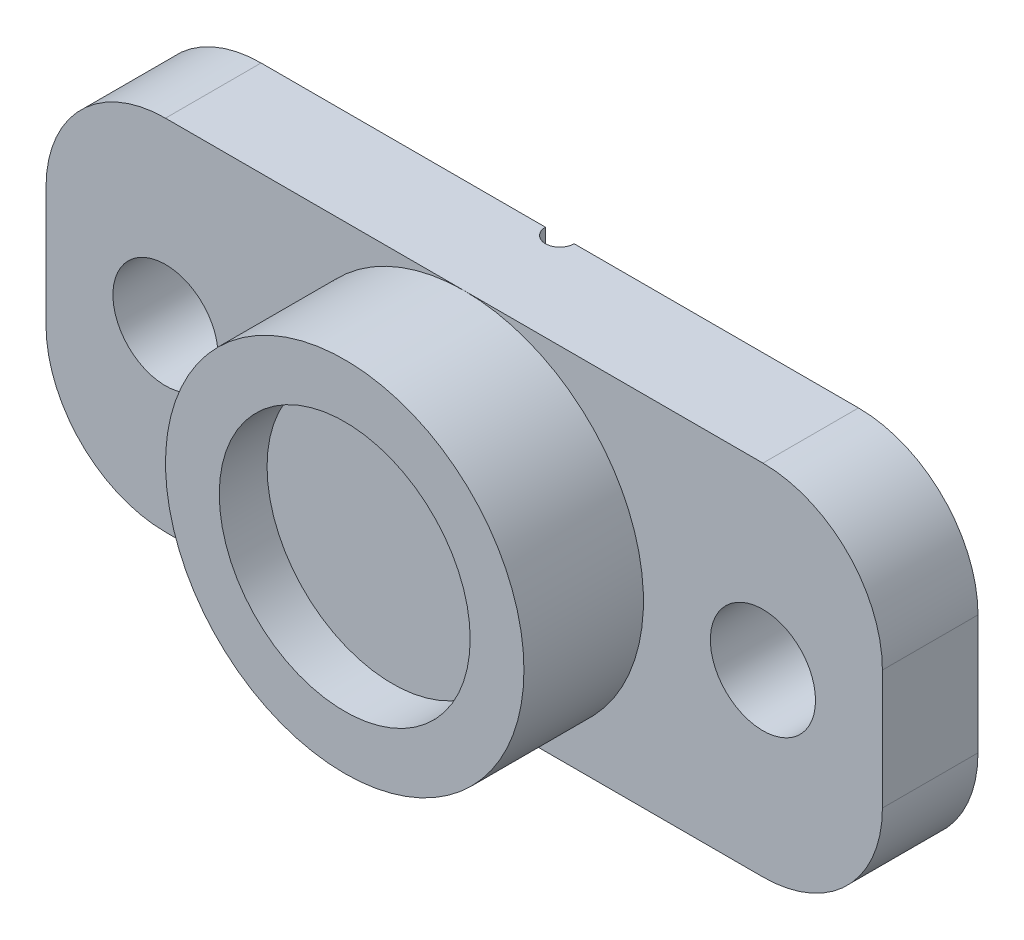
ISO-10303-21;
HEADER;
FILE_DESCRIPTION(('STEP AP214'),'2;1');
FILE_NAME('part.step','',(''),(''),'','','');
FILE_SCHEMA(('AUTOMOTIVE_DESIGN { 1 0 10303 214 1 1 1 1 }'));
ENDSEC;
DATA;
#1=APPLICATION_CONTEXT('core data for automotive mechanical design processes');
#2=APPLICATION_PROTOCOL_DEFINITION('international standard','automotive_design',2000,#1);
#3=PRODUCT_CONTEXT('',#1,'mechanical');
#4=PRODUCT('Part','Part','',(#3));
#5=PRODUCT_RELATED_PRODUCT_CATEGORY('part','',(#4));
#6=PRODUCT_DEFINITION_FORMATION('','',#4);
#7=PRODUCT_DEFINITION_CONTEXT('part definition',#1,'design');
#8=PRODUCT_DEFINITION('design','',#6,#7);
#9=PRODUCT_DEFINITION_SHAPE('','',#8);
#10=(LENGTH_UNIT() NAMED_UNIT(*) SI_UNIT(.MILLI.,.METRE.));
#11=(NAMED_UNIT(*) PLANE_ANGLE_UNIT() SI_UNIT($,.RADIAN.));
#12=(NAMED_UNIT(*) SI_UNIT($,.STERADIAN.) SOLID_ANGLE_UNIT());
#13=UNCERTAINTY_MEASURE_WITH_UNIT(LENGTH_MEASURE(1.E-05),#10,'distance_accuracy_value','');
#14=(GEOMETRIC_REPRESENTATION_CONTEXT(3) GLOBAL_UNCERTAINTY_ASSIGNED_CONTEXT((#13)) GLOBAL_UNIT_ASSIGNED_CONTEXT((#10,
#11,#12)) REPRESENTATION_CONTEXT('',''));
#15=CARTESIAN_POINT('',(0.,0.,0.));
#16=DIRECTION('',(0.,0.,1.));
#17=DIRECTION('',(1.,0.,0.));
#18=AXIS2_PLACEMENT_3D('',#15,#16,#17);
#19=CARTESIAN_POINT('',(0.,0.,0.));
#20=DIRECTION('',(0.,0.,-1.));
#21=DIRECTION('',(-1.,0.,0.));
#22=AXIS2_PLACEMENT_3D('',#19,#20,#21);
#23=PLANE('',#22);
#24=DIRECTION('',(0.,1.,0.));
#25=VECTOR('',#24,1.);
#26=CARTESIAN_POINT('',(16.9,-17.,0.));
#27=LINE('',#26,#25);
#28=CARTESIAN_POINT('',(16.9,0.,0.));
#29=VERTEX_POINT('',#28);
#30=CARTESIAN_POINT('',(16.9,15.,0.));
#31=VERTEX_POINT('',#30);
#32=EDGE_CURVE('E50',#29,#31,#27,.T.);
#33=ORIENTED_EDGE('',*,*,#32,.F.);
#34=DIRECTION('',(1.,0.,0.));
#35=VECTOR('',#34,1.);
#36=CARTESIAN_POINT('',(35.,0.,0.));
#37=LINE('',#36,#35);
#38=CARTESIAN_POINT('',(5.,0.,0.));
#39=VERTEX_POINT('',#38);
#40=EDGE_CURVE('E201',#39,#29,#37,.T.);
#41=ORIENTED_EDGE('',*,*,#40,.F.);
#42=CARTESIAN_POINT('',(5.,5.,0.));
#43=DIRECTION('',(0.,0.,-1.));
#44=DIRECTION('',(-1.,0.,0.));
#45=AXIS2_PLACEMENT_3D('',#42,#43,#44);
#46=CIRCLE('',#45,5.);
#47=CARTESIAN_POINT('',(0.,5.,0.));
#48=VERTEX_POINT('',#47);
#49=EDGE_CURVE('E163',#39,#48,#46,.T.);
#50=ORIENTED_EDGE('',*,*,#49,.T.);
#51=DIRECTION('',(0.,-1.,0.));
#52=VECTOR('',#51,1.);
#53=CARTESIAN_POINT('',(0.,0.,0.));
#54=LINE('',#53,#52);
#55=CARTESIAN_POINT('',(0.,10.,0.));
#56=VERTEX_POINT('',#55);
#57=EDGE_CURVE('E140',#56,#48,#54,.T.);
#58=ORIENTED_EDGE('',*,*,#57,.F.);
#59=CARTESIAN_POINT('',(5.,10.,0.));
#60=DIRECTION('',(0.,0.,-1.));
#61=DIRECTION('',(-1.,0.,0.));
#62=AXIS2_PLACEMENT_3D('',#59,#60,#61);
#63=CIRCLE('',#62,5.);
#64=CARTESIAN_POINT('',(5.,15.,0.));
#65=VERTEX_POINT('',#64);
#66=EDGE_CURVE('E160',#56,#65,#63,.T.);
#67=ORIENTED_EDGE('',*,*,#66,.T.);
#68=DIRECTION('',(-1.,0.,0.));
#69=VECTOR('',#68,1.);
#70=CARTESIAN_POINT('',(0.,15.,0.));
#71=LINE('',#70,#69);
#72=EDGE_CURVE('E141',#31,#65,#71,.T.);
#73=ORIENTED_EDGE('',*,*,#72,.F.);
#74=EDGE_LOOP('',(#33,#41,#50,#58,#67,#73));
#75=FACE_BOUND('',#74,.T.);
#76=CARTESIAN_POINT('',(5.,7.5,0.));
#77=DIRECTION('',(0.,0.,1.));
#78=DIRECTION('',(1.,0.,0.));
#79=AXIS2_PLACEMENT_3D('',#76,#77,#78);
#80=CIRCLE('',#79,2.2);
#81=CARTESIAN_POINT('',(7.2,7.5,0.));
#82=VERTEX_POINT('',#81);
#83=EDGE_CURVE('E213',#82,#82,#80,.T.);
#84=ORIENTED_EDGE('',*,*,#83,.T.);
#85=EDGE_LOOP('',(#84));
#86=FACE_BOUND('',#85,.T.);
#87=ADVANCED_FACE('F35',(#75,#86),#23,.T.);
#88=CARTESIAN_POINT('',(0.,0.,4.));
#89=DIRECTION('',(0.,0.,-1.));
#90=DIRECTION('',(-1.,0.,0.));
#91=AXIS2_PLACEMENT_3D('',#88,#89,#90);
#92=PLANE('',#91);
#93=DIRECTION('',(0.,-1.,0.));
#94=VECTOR('',#93,1.);
#95=CARTESIAN_POINT('',(0.,0.,4.));
#96=LINE('',#95,#94);
#97=CARTESIAN_POINT('',(0.,10.,4.));
#98=VERTEX_POINT('',#97);
#99=CARTESIAN_POINT('',(0.,5.,4.));
#100=VERTEX_POINT('',#99);
#101=EDGE_CURVE('E207',#98,#100,#96,.T.);
#102=ORIENTED_EDGE('',*,*,#101,.T.);
#103=CARTESIAN_POINT('',(5.,5.,4.));
#104=DIRECTION('',(0.,0.,-1.));
#105=DIRECTION('',(-1.,0.,0.));
#106=AXIS2_PLACEMENT_3D('',#103,#104,#105);
#107=CIRCLE('',#106,5.);
#108=CARTESIAN_POINT('',(5.,0.,4.));
#109=VERTEX_POINT('',#108);
#110=EDGE_CURVE('E172',#100,#109,#107,.F.);
#111=ORIENTED_EDGE('',*,*,#110,.T.);
#112=DIRECTION('',(1.,0.,0.));
#113=VECTOR('',#112,1.);
#114=CARTESIAN_POINT('',(35.,0.,4.));
#115=LINE('',#114,#113);
#116=CARTESIAN_POINT('',(17.5,0.,4.));
#117=VERTEX_POINT('',#116);
#118=EDGE_CURVE('E198',#109,#117,#115,.T.);
#119=ORIENTED_EDGE('',*,*,#118,.T.);
#120=CARTESIAN_POINT('',(17.5,7.5,4.));
#121=DIRECTION('',(0.,0.,1.));
#122=DIRECTION('',(1.,0.,0.));
#123=AXIS2_PLACEMENT_3D('',#120,#121,#122);
#124=CIRCLE('',#123,7.5);
#125=CARTESIAN_POINT('',(17.5,15.,4.));
#126=VERTEX_POINT('',#125);
#127=EDGE_CURVE('E225',#126,#117,#124,.T.);
#128=ORIENTED_EDGE('',*,*,#127,.F.);
#129=DIRECTION('',(-1.,0.,0.));
#130=VECTOR('',#129,1.);
#131=CARTESIAN_POINT('',(0.,15.,4.));
#132=LINE('',#131,#130);
#133=CARTESIAN_POINT('',(5.,15.,4.));
#134=VERTEX_POINT('',#133);
#135=EDGE_CURVE('E197',#126,#134,#132,.T.);
#136=ORIENTED_EDGE('',*,*,#135,.T.);
#137=CARTESIAN_POINT('',(5.,10.,4.));
#138=DIRECTION('',(0.,0.,-1.));
#139=DIRECTION('',(-1.,0.,0.));
#140=AXIS2_PLACEMENT_3D('',#137,#138,#139);
#141=CIRCLE('',#140,5.);
#142=EDGE_CURVE('E170',#134,#98,#141,.F.);
#143=ORIENTED_EDGE('',*,*,#142,.T.);
#144=EDGE_LOOP('',(#102,#111,#119,#128,#136,#143));
#145=FACE_BOUND('',#144,.T.);
#146=CARTESIAN_POINT('',(5.,7.5,4.));
#147=DIRECTION('',(0.,0.,1.));
#148=DIRECTION('',(1.,0.,0.));
#149=AXIS2_PLACEMENT_3D('',#146,#147,#148);
#150=CIRCLE('',#149,2.2);
#151=CARTESIAN_POINT('',(7.2,7.5,4.));
#152=VERTEX_POINT('',#151);
#153=EDGE_CURVE('E205',#152,#152,#150,.T.);
#154=ORIENTED_EDGE('',*,*,#153,.F.);
#155=EDGE_LOOP('',(#154));
#156=FACE_BOUND('',#155,.T.);
#157=ADVANCED_FACE('F245',(#145,#156),#92,.F.);
#158=CARTESIAN_POINT('',(30.,0.,4.));
#159=VERTEX_POINT('',#158);
#160=EDGE_CURVE('E144',#117,#159,#115,.T.);
#161=ORIENTED_EDGE('',*,*,#160,.T.);
#162=CARTESIAN_POINT('',(30.,5.,4.));
#163=DIRECTION('',(0.,0.,-1.));
#164=DIRECTION('',(-1.,0.,0.));
#165=AXIS2_PLACEMENT_3D('',#162,#163,#164);
#166=CIRCLE('',#165,5.);
#167=CARTESIAN_POINT('',(35.,5.,4.));
#168=VERTEX_POINT('',#167);
#169=EDGE_CURVE('E124',#159,#168,#166,.F.);
#170=ORIENTED_EDGE('',*,*,#169,.T.);
#171=DIRECTION('',(0.,1.,0.));
#172=VECTOR('',#171,1.);
#173=CARTESIAN_POINT('',(35.,15.,4.));
#174=LINE('',#173,#172);
#175=CARTESIAN_POINT('',(35.,10.,4.));
#176=VERTEX_POINT('',#175);
#177=EDGE_CURVE('E188',#168,#176,#174,.T.);
#178=ORIENTED_EDGE('',*,*,#177,.T.);
#179=CARTESIAN_POINT('',(30.,10.,4.));
#180=DIRECTION('',(0.,0.,-1.));
#181=DIRECTION('',(-1.,0.,0.));
#182=AXIS2_PLACEMENT_3D('',#179,#180,#181);
#183=CIRCLE('',#182,5.);
#184=CARTESIAN_POINT('',(30.,15.,4.));
#185=VERTEX_POINT('',#184);
#186=EDGE_CURVE('E181',#176,#185,#183,.F.);
#187=ORIENTED_EDGE('',*,*,#186,.T.);
#188=EDGE_CURVE('E210',#185,#126,#132,.T.);
#189=ORIENTED_EDGE('',*,*,#188,.T.);
#190=EDGE_CURVE('E153',#117,#126,#124,.T.);
#191=ORIENTED_EDGE('',*,*,#190,.F.);
#192=EDGE_LOOP('',(#161,#170,#178,#187,#189,#191));
#193=FACE_BOUND('',#192,.T.);
#194=CARTESIAN_POINT('',(30.,7.5,4.));
#195=DIRECTION('',(0.,0.,1.));
#196=DIRECTION('',(1.,0.,0.));
#197=AXIS2_PLACEMENT_3D('',#194,#195,#196);
#198=CIRCLE('',#197,2.2);
#199=CARTESIAN_POINT('',(32.2,7.5,4.));
#200=VERTEX_POINT('',#199);
#201=EDGE_CURVE('E216',#200,#200,#198,.T.);
#202=ORIENTED_EDGE('',*,*,#201,.F.);
#203=EDGE_LOOP('',(#202));
#204=FACE_BOUND('',#203,.T.);
#205=ADVANCED_FACE('F186',(#193,#204),#92,.F.);
#206=DIRECTION('',(0.,1.,0.));
#207=VECTOR('',#206,1.);
#208=CARTESIAN_POINT('',(18.1,-17.,0.));
#209=LINE('',#208,#207);
#210=CARTESIAN_POINT('',(18.1,15.,0.));
#211=VERTEX_POINT('',#210);
#212=CARTESIAN_POINT('',(18.1,0.,0.));
#213=VERTEX_POINT('',#212);
#214=EDGE_CURVE('E119',#211,#213,#209,.F.);
#215=ORIENTED_EDGE('',*,*,#214,.F.);
#216=CARTESIAN_POINT('',(30.,15.,0.));
#217=VERTEX_POINT('',#216);
#218=EDGE_CURVE('E130',#217,#211,#71,.T.);
#219=ORIENTED_EDGE('',*,*,#218,.F.);
#220=CARTESIAN_POINT('',(30.,10.,0.));
#221=DIRECTION('',(0.,0.,-1.));
#222=DIRECTION('',(-1.,0.,0.));
#223=AXIS2_PLACEMENT_3D('',#220,#221,#222);
#224=CIRCLE('',#223,5.);
#225=CARTESIAN_POINT('',(35.,10.,0.));
#226=VERTEX_POINT('',#225);
#227=EDGE_CURVE('E156',#217,#226,#224,.T.);
#228=ORIENTED_EDGE('',*,*,#227,.T.);
#229=DIRECTION('',(0.,1.,0.));
#230=VECTOR('',#229,1.);
#231=CARTESIAN_POINT('',(35.,15.,0.));
#232=LINE('',#231,#230);
#233=CARTESIAN_POINT('',(35.,5.,0.));
#234=VERTEX_POINT('',#233);
#235=EDGE_CURVE('E146',#234,#226,#232,.T.);
#236=ORIENTED_EDGE('',*,*,#235,.F.);
#237=CARTESIAN_POINT('',(30.,5.,0.));
#238=DIRECTION('',(0.,0.,-1.));
#239=DIRECTION('',(-1.,0.,0.));
#240=AXIS2_PLACEMENT_3D('',#237,#238,#239);
#241=CIRCLE('',#240,5.);
#242=CARTESIAN_POINT('',(30.,0.,0.));
#243=VERTEX_POINT('',#242);
#244=EDGE_CURVE('E158',#234,#243,#241,.T.);
#245=ORIENTED_EDGE('',*,*,#244,.T.);
#246=EDGE_CURVE('E132',#213,#243,#37,.T.);
#247=ORIENTED_EDGE('',*,*,#246,.F.);
#248=EDGE_LOOP('',(#215,#219,#228,#236,#245,#247));
#249=FACE_BOUND('',#248,.T.);
#250=CARTESIAN_POINT('',(30.,7.5,0.));
#251=DIRECTION('',(0.,0.,1.));
#252=DIRECTION('',(1.,0.,0.));
#253=AXIS2_PLACEMENT_3D('',#250,#251,#252);
#254=CIRCLE('',#253,2.2);
#255=CARTESIAN_POINT('',(32.2,7.5,0.));
#256=VERTEX_POINT('',#255);
#257=EDGE_CURVE('E219',#256,#256,#254,.T.);
#258=ORIENTED_EDGE('',*,*,#257,.T.);
#259=EDGE_LOOP('',(#258));
#260=FACE_BOUND('',#259,.T.);
#261=ADVANCED_FACE('F128',(#249,#260),#23,.T.);
#262=CARTESIAN_POINT('',(35.,0.,4.));
#263=DIRECTION('',(0.,1.,0.));
#264=DIRECTION('',(-1.,0.,0.));
#265=AXIS2_PLACEMENT_3D('',#262,#263,#264);
#266=PLANE('',#265);
#267=ORIENTED_EDGE('',*,*,#40,.T.);
#268=CARTESIAN_POINT('',(17.5,0.,0.));
#269=DIRECTION('',(0.,1.,0.));
#270=DIRECTION('',(-1.,0.,0.));
#271=AXIS2_PLACEMENT_3D('',#268,#269,#270);
#272=CIRCLE('',#271,0.6);
#273=EDGE_CURVE('E133',#29,#213,#272,.T.);
#274=ORIENTED_EDGE('',*,*,#273,.T.);
#275=ORIENTED_EDGE('',*,*,#246,.T.);
#276=DIRECTION('',(0.,0.,-1.));
#277=VECTOR('',#276,1.);
#278=CARTESIAN_POINT('',(30.,0.,4.));
#279=LINE('',#278,#277);
#280=EDGE_CURVE('E150',#243,#159,#279,.F.);
#281=ORIENTED_EDGE('',*,*,#280,.T.);
#282=ORIENTED_EDGE('',*,*,#160,.F.);
#283=ORIENTED_EDGE('',*,*,#118,.F.);
#284=DIRECTION('',(0.,0.,-1.));
#285=VECTOR('',#284,1.);
#286=CARTESIAN_POINT('',(5.,0.,4.));
#287=LINE('',#286,#285);
#288=EDGE_CURVE('E152',#109,#39,#287,.T.);
#289=ORIENTED_EDGE('',*,*,#288,.T.);
#290=EDGE_LOOP('',(#267,#274,#275,#281,#282,#283,#289));
#291=FACE_BOUND('',#290,.T.);
#292=ADVANCED_FACE('F234',(#291),#266,.F.);
#293=CARTESIAN_POINT('',(35.,15.,4.));
#294=DIRECTION('',(-1.,0.,0.));
#295=DIRECTION('',(0.,0.,1.));
#296=AXIS2_PLACEMENT_3D('',#293,#294,#295);
#297=PLANE('',#296);
#298=ORIENTED_EDGE('',*,*,#177,.F.);
#299=DIRECTION('',(0.,0.,-1.));
#300=VECTOR('',#299,1.);
#301=CARTESIAN_POINT('',(35.,5.,4.));
#302=LINE('',#301,#300);
#303=EDGE_CURVE('E178',#168,#234,#302,.T.);
#304=ORIENTED_EDGE('',*,*,#303,.T.);
#305=ORIENTED_EDGE('',*,*,#235,.T.);
#306=DIRECTION('',(0.,0.,-1.));
#307=VECTOR('',#306,1.);
#308=CARTESIAN_POINT('',(35.,10.,4.));
#309=LINE('',#308,#307);
#310=EDGE_CURVE('E58',#226,#176,#309,.F.);
#311=ORIENTED_EDGE('',*,*,#310,.T.);
#312=EDGE_LOOP('',(#298,#304,#305,#311));
#313=FACE_BOUND('',#312,.T.);
#314=ADVANCED_FACE('F195',(#313),#297,.F.);
#315=CARTESIAN_POINT('',(0.,15.,4.));
#316=DIRECTION('',(0.,-1.,0.));
#317=DIRECTION('',(0.,0.,-1.));
#318=AXIS2_PLACEMENT_3D('',#315,#316,#317);
#319=PLANE('',#318);
#320=ORIENTED_EDGE('',*,*,#218,.T.);
#321=CARTESIAN_POINT('',(17.5,15.,0.));
#322=DIRECTION('',(0.,-1.,0.));
#323=DIRECTION('',(0.,0.,-1.));
#324=AXIS2_PLACEMENT_3D('',#321,#322,#323);
#325=CIRCLE('',#324,0.6);
#326=EDGE_CURVE('E43',#211,#31,#325,.T.);
#327=ORIENTED_EDGE('',*,*,#326,.T.);
#328=ORIENTED_EDGE('',*,*,#72,.T.);
#329=DIRECTION('',(0.,0.,-1.));
#330=VECTOR('',#329,1.);
#331=CARTESIAN_POINT('',(5.,15.,4.));
#332=LINE('',#331,#330);
#333=EDGE_CURVE('E175',#65,#134,#332,.F.);
#334=ORIENTED_EDGE('',*,*,#333,.T.);
#335=ORIENTED_EDGE('',*,*,#135,.F.);
#336=ORIENTED_EDGE('',*,*,#188,.F.);
#337=DIRECTION('',(0.,0.,-1.));
#338=VECTOR('',#337,1.);
#339=CARTESIAN_POINT('',(30.,15.,4.));
#340=LINE('',#339,#338);
#341=EDGE_CURVE('E139',#185,#217,#340,.T.);
#342=ORIENTED_EDGE('',*,*,#341,.T.);
#343=EDGE_LOOP('',(#320,#327,#328,#334,#335,#336,#342));
#344=FACE_BOUND('',#343,.T.);
#345=ADVANCED_FACE('F136',(#344),#319,.F.);
#346=CARTESIAN_POINT('',(0.,0.,4.));
#347=DIRECTION('',(1.,0.,0.));
#348=DIRECTION('',(0.,0.,-1.));
#349=AXIS2_PLACEMENT_3D('',#346,#347,#348);
#350=PLANE('',#349);
#351=ORIENTED_EDGE('',*,*,#57,.T.);
#352=DIRECTION('',(0.,0.,-1.));
#353=VECTOR('',#352,1.);
#354=CARTESIAN_POINT('',(0.,5.,4.));
#355=LINE('',#354,#353);
#356=EDGE_CURVE('E168',#48,#100,#355,.F.);
#357=ORIENTED_EDGE('',*,*,#356,.T.);
#358=ORIENTED_EDGE('',*,*,#101,.F.);
#359=DIRECTION('',(0.,0.,-1.));
#360=VECTOR('',#359,1.);
#361=CARTESIAN_POINT('',(0.,10.,4.));
#362=LINE('',#361,#360);
#363=EDGE_CURVE('E165',#98,#56,#362,.T.);
#364=ORIENTED_EDGE('',*,*,#363,.T.);
#365=EDGE_LOOP('',(#351,#357,#358,#364));
#366=FACE_BOUND('',#365,.T.);
#367=ADVANCED_FACE('F252',(#366),#350,.F.);
#368=CARTESIAN_POINT('',(5.,7.5,4.));
#369=DIRECTION('',(0.,0.,-1.));
#370=DIRECTION('',(-1.,0.,0.));
#371=AXIS2_PLACEMENT_3D('',#368,#369,#370);
#372=CYLINDRICAL_SURFACE('',#371,2.2);
#373=ORIENTED_EDGE('',*,*,#153,.T.);
#374=EDGE_LOOP('',(#373));
#375=FACE_BOUND('',#374,.T.);
#376=ORIENTED_EDGE('',*,*,#83,.F.);
#377=EDGE_LOOP('',(#376));
#378=FACE_BOUND('',#377,.T.);
#379=ADVANCED_FACE('F293',(#375,#378),#372,.F.);
#380=CARTESIAN_POINT('',(30.,7.5,4.));
#381=DIRECTION('',(0.,0.,-1.));
#382=DIRECTION('',(-1.,0.,0.));
#383=AXIS2_PLACEMENT_3D('',#380,#381,#382);
#384=CYLINDRICAL_SURFACE('',#383,2.2);
#385=ORIENTED_EDGE('',*,*,#201,.T.);
#386=EDGE_LOOP('',(#385));
#387=FACE_BOUND('',#386,.T.);
#388=ORIENTED_EDGE('',*,*,#257,.F.);
#389=EDGE_LOOP('',(#388));
#390=FACE_BOUND('',#389,.T.);
#391=ADVANCED_FACE('F272',(#387,#390),#384,.F.);
#392=CARTESIAN_POINT('',(17.5,7.5,9.));
#393=DIRECTION('',(0.,0.,1.));
#394=DIRECTION('',(1.,0.,0.));
#395=AXIS2_PLACEMENT_3D('',#392,#393,#394);
#396=PLANE('',#395);
#397=CARTESIAN_POINT('',(17.5,7.5,9.));
#398=DIRECTION('',(0.,0.,1.));
#399=DIRECTION('',(1.,0.,0.));
#400=AXIS2_PLACEMENT_3D('',#397,#398,#399);
#401=CIRCLE('',#400,7.5);
#402=CARTESIAN_POINT('',(25.,7.5,9.));
#403=VERTEX_POINT('',#402);
#404=EDGE_CURVE('E222',#403,#403,#401,.T.);
#405=ORIENTED_EDGE('',*,*,#404,.T.);
#406=EDGE_LOOP('',(#405));
#407=FACE_BOUND('',#406,.T.);
#408=CARTESIAN_POINT('',(17.5,7.5,9.));
#409=DIRECTION('',(0.,0.,1.));
#410=DIRECTION('',(1.,0.,0.));
#411=AXIS2_PLACEMENT_3D('',#408,#409,#410);
#412=CIRCLE('',#411,5.25);
#413=CARTESIAN_POINT('',(22.75,7.5,9.));
#414=VERTEX_POINT('',#413);
#415=EDGE_CURVE('E228',#414,#414,#412,.T.);
#416=ORIENTED_EDGE('',*,*,#415,.F.);
#417=EDGE_LOOP('',(#416));
#418=FACE_BOUND('',#417,.T.);
#419=ADVANCED_FACE('F263',(#407,#418),#396,.T.);
#420=CARTESIAN_POINT('',(17.5,7.5,9.));
#421=DIRECTION('',(0.,0.,-1.));
#422=DIRECTION('',(-1.,0.,0.));
#423=AXIS2_PLACEMENT_3D('',#420,#421,#422);
#424=CYLINDRICAL_SURFACE('',#423,7.5);
#425=ORIENTED_EDGE('',*,*,#404,.F.);
#426=EDGE_LOOP('',(#425));
#427=FACE_BOUND('',#426,.T.);
#428=ORIENTED_EDGE('',*,*,#127,.T.);
#429=ORIENTED_EDGE('',*,*,#190,.T.);
#430=EDGE_LOOP('',(#428,#429));
#431=FACE_BOUND('',#430,.T.);
#432=ADVANCED_FACE('F260',(#427,#431),#424,.T.);
#433=CARTESIAN_POINT('',(17.5,7.5,9.));
#434=DIRECTION('',(0.,0.,-1.));
#435=DIRECTION('',(-1.,0.,0.));
#436=AXIS2_PLACEMENT_3D('',#433,#434,#435);
#437=CYLINDRICAL_SURFACE('',#436,5.25);
#438=CARTESIAN_POINT('',(17.5,7.5,7.));
#439=DIRECTION('',(0.,0.,1.));
#440=DIRECTION('',(1.,0.,0.));
#441=AXIS2_PLACEMENT_3D('',#438,#439,#440);
#442=CIRCLE('',#441,5.25);
#443=CARTESIAN_POINT('',(22.75,7.5,7.));
#444=VERTEX_POINT('',#443);
#445=EDGE_CURVE('E11',#444,#444,#442,.T.);
#446=ORIENTED_EDGE('',*,*,#445,.F.);
#447=EDGE_LOOP('',(#446));
#448=FACE_BOUND('',#447,.T.);
#449=ORIENTED_EDGE('',*,*,#415,.T.);
#450=EDGE_LOOP('',(#449));
#451=FACE_BOUND('',#450,.T.);
#452=ADVANCED_FACE('F262',(#448,#451),#437,.F.);
#453=CARTESIAN_POINT('',(5.,5.,4.));
#454=DIRECTION('',(0.,0.,-1.));
#455=DIRECTION('',(-1.,0.,0.));
#456=AXIS2_PLACEMENT_3D('',#453,#454,#455);
#457=CYLINDRICAL_SURFACE('',#456,5.);
#458=ORIENTED_EDGE('',*,*,#110,.F.);
#459=ORIENTED_EDGE('',*,*,#356,.F.);
#460=ORIENTED_EDGE('',*,*,#49,.F.);
#461=ORIENTED_EDGE('',*,*,#288,.F.);
#462=EDGE_LOOP('',(#458,#459,#460,#461));
#463=FACE_BOUND('',#462,.T.);
#464=ADVANCED_FACE('F257',(#463),#457,.T.);
#465=CARTESIAN_POINT('',(5.,10.,4.));
#466=DIRECTION('',(0.,0.,-1.));
#467=DIRECTION('',(-1.,0.,0.));
#468=AXIS2_PLACEMENT_3D('',#465,#466,#467);
#469=CYLINDRICAL_SURFACE('',#468,5.);
#470=ORIENTED_EDGE('',*,*,#142,.F.);
#471=ORIENTED_EDGE('',*,*,#333,.F.);
#472=ORIENTED_EDGE('',*,*,#66,.F.);
#473=ORIENTED_EDGE('',*,*,#363,.F.);
#474=EDGE_LOOP('',(#470,#471,#472,#473));
#475=FACE_BOUND('',#474,.T.);
#476=ADVANCED_FACE('F250',(#475),#469,.T.);
#477=CARTESIAN_POINT('',(30.,5.,4.));
#478=DIRECTION('',(0.,0.,-1.));
#479=DIRECTION('',(-1.,0.,0.));
#480=AXIS2_PLACEMENT_3D('',#477,#478,#479);
#481=CYLINDRICAL_SURFACE('',#480,5.);
#482=ORIENTED_EDGE('',*,*,#169,.F.);
#483=ORIENTED_EDGE('',*,*,#280,.F.);
#484=ORIENTED_EDGE('',*,*,#244,.F.);
#485=ORIENTED_EDGE('',*,*,#303,.F.);
#486=EDGE_LOOP('',(#482,#483,#484,#485));
#487=FACE_BOUND('',#486,.T.);
#488=ADVANCED_FACE('F200',(#487),#481,.T.);
#489=CARTESIAN_POINT('',(30.,10.,4.));
#490=DIRECTION('',(0.,0.,-1.));
#491=DIRECTION('',(-1.,0.,0.));
#492=AXIS2_PLACEMENT_3D('',#489,#490,#491);
#493=CYLINDRICAL_SURFACE('',#492,5.);
#494=ORIENTED_EDGE('',*,*,#186,.F.);
#495=ORIENTED_EDGE('',*,*,#310,.F.);
#496=ORIENTED_EDGE('',*,*,#227,.F.);
#497=ORIENTED_EDGE('',*,*,#341,.F.);
#498=EDGE_LOOP('',(#494,#495,#496,#497));
#499=FACE_BOUND('',#498,.T.);
#500=ADVANCED_FACE('F37',(#499),#493,.T.);
#501=CARTESIAN_POINT('',(17.5,-17.,0.));
#502=DIRECTION('',(0.,1.,0.));
#503=DIRECTION('',(0.,0.,1.));
#504=AXIS2_PLACEMENT_3D('',#501,#502,#503);
#505=CYLINDRICAL_SURFACE('',#504,0.6);
#506=ORIENTED_EDGE('',*,*,#32,.T.);
#507=ORIENTED_EDGE('',*,*,#326,.F.);
#508=ORIENTED_EDGE('',*,*,#214,.T.);
#509=ORIENTED_EDGE('',*,*,#273,.F.);
#510=EDGE_LOOP('',(#506,#507,#508,#509));
#511=FACE_BOUND('',#510,.T.);
#512=ADVANCED_FACE('F118',(#511),#505,.F.);
#513=CARTESIAN_POINT('',(17.5,7.5,7.));
#514=DIRECTION('',(0.,0.,1.));
#515=DIRECTION('',(1.,0.,0.));
#516=AXIS2_PLACEMENT_3D('',#513,#514,#515);
#517=PLANE('',#516);
#518=ORIENTED_EDGE('',*,*,#445,.T.);
#519=EDGE_LOOP('',(#518));
#520=FACE_BOUND('',#519,.T.);
#521=ADVANCED_FACE('F402',(#520),#517,.T.);
#522=CLOSED_SHELL('',(#87,#157,#205,#261,#292,#314,#345,#367,#379,#391,#419,#432,#452,#464,#476,
#488,#500,#512,#521));
#523=MANIFOLD_SOLID_BREP('B2',#522);
#524=ADVANCED_BREP_SHAPE_REPRESENTATION('',(#18,#523),#14);
#525=SHAPE_DEFINITION_REPRESENTATION(#9,#524);
ENDSEC;
END-ISO-10303-21;
